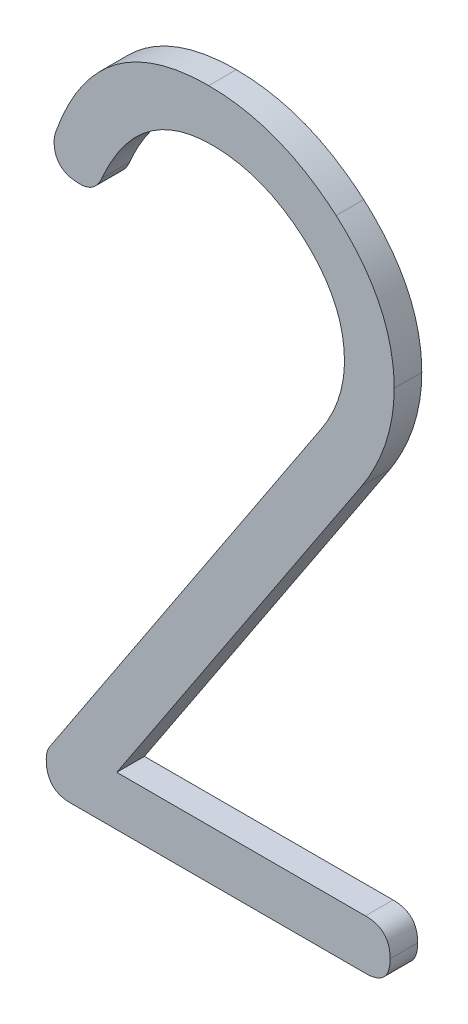
ISO-10303-21;
HEADER;
FILE_DESCRIPTION(('STEP AP214'),'2;1');
FILE_NAME('part.step','',(''),(''),'','','');
FILE_SCHEMA(('AUTOMOTIVE_DESIGN { 1 0 10303 214 1 1 1 1 }'));
ENDSEC;
DATA;
#1=APPLICATION_CONTEXT('core data for automotive mechanical design processes');
#2=APPLICATION_PROTOCOL_DEFINITION('international standard','automotive_design',2000,#1);
#3=PRODUCT_CONTEXT('',#1,'mechanical');
#4=PRODUCT('Part','Part','',(#3));
#5=PRODUCT_RELATED_PRODUCT_CATEGORY('part','',(#4));
#6=PRODUCT_DEFINITION_FORMATION('','',#4);
#7=PRODUCT_DEFINITION_CONTEXT('part definition',#1,'design');
#8=PRODUCT_DEFINITION('design','',#6,#7);
#9=PRODUCT_DEFINITION_SHAPE('','',#8);
#10=(LENGTH_UNIT() NAMED_UNIT(*) SI_UNIT(.MILLI.,.METRE.));
#11=(NAMED_UNIT(*) PLANE_ANGLE_UNIT() SI_UNIT($,.RADIAN.));
#12=(NAMED_UNIT(*) SI_UNIT($,.STERADIAN.) SOLID_ANGLE_UNIT());
#13=UNCERTAINTY_MEASURE_WITH_UNIT(LENGTH_MEASURE(1.E-05),#10,'distance_accuracy_value','');
#14=(GEOMETRIC_REPRESENTATION_CONTEXT(3) GLOBAL_UNCERTAINTY_ASSIGNED_CONTEXT((#13)) GLOBAL_UNIT_ASSIGNED_CONTEXT((#10,
#11,#12)) REPRESENTATION_CONTEXT('',''));
#15=CARTESIAN_POINT('',(0.,0.,0.));
#16=DIRECTION('',(0.,0.,1.));
#17=DIRECTION('',(1.,0.,0.));
#18=AXIS2_PLACEMENT_3D('',#15,#16,#17);
#19=CARTESIAN_POINT('',(0.,0.,1.6));
#20=DIRECTION('',(0.,0.,-1.));
#21=DIRECTION('',(-1.,0.,0.));
#22=AXIS2_PLACEMENT_3D('',#19,#20,#21);
#23=PLANE('',#22);
#24=DIRECTION('',(-1.,0.,0.));
#25=VECTOR('',#24,1.);
#26=CARTESIAN_POINT('',(0.,-21.8933047798276,1.6));
#27=LINE('',#26,#25);
#28=CARTESIAN_POINT('',(11.0245562474728,-21.8933047798276,1.6));
#29=VERTEX_POINT('',#28);
#30=CARTESIAN_POINT('',(11.9250562474728,-21.8933047798276,1.6));
#31=VERTEX_POINT('',#30);
#32=EDGE_CURVE('E153',#29,#31,#27,.F.);
#33=ORIENTED_EDGE('',*,*,#32,.T.);
#34=CARTESIAN_POINT('',(11.9250562474728,-21.8933047798276,1.6));
#35=CARTESIAN_POINT('',(12.0143687474728,-21.8933047798276,1.6));
#36=CARTESIAN_POINT('',(12.0143687474728,-21.9833047798276,1.6));
#37=B_SPLINE_CURVE_WITH_KNOTS('',2,(#34,#35,#36),.UNSPECIFIED.,.F.,.F.,(3,3),(0.,1.),.UNSPECIFIED.);
#38=CARTESIAN_POINT('',(12.0143687474728,-21.9833047798276,1.6));
#39=VERTEX_POINT('',#38);
#40=EDGE_CURVE('E148',#31,#39,#37,.T.);
#41=ORIENTED_EDGE('',*,*,#40,.T.);
#42=CARTESIAN_POINT('',(12.0143687474728,-21.9833047798276,1.6));
#43=CARTESIAN_POINT('',(12.0143687474728,-22.0733047798276,1.6));
#44=CARTESIAN_POINT('',(11.9250562474728,-22.0733047798276,1.6));
#45=B_SPLINE_CURVE_WITH_KNOTS('',2,(#42,#43,#44),.UNSPECIFIED.,.F.,.F.,(3,3),(0.,1.),.UNSPECIFIED.);
#46=CARTESIAN_POINT('',(11.9250562474728,-22.0733047798276,1.6));
#47=VERTEX_POINT('',#46);
#48=EDGE_CURVE('E149',#39,#47,#45,.T.);
#49=ORIENTED_EDGE('',*,*,#48,.T.);
#50=DIRECTION('',(1.,0.,0.));
#51=VECTOR('',#50,1.);
#52=CARTESIAN_POINT('',(11.9250562474728,-22.0733047798276,1.6));
#53=LINE('',#52,#51);
#54=CARTESIAN_POINT('',(10.8566187474728,-22.0733047798276,1.6));
#55=VERTEX_POINT('',#54);
#56=EDGE_CURVE('E156',#55,#47,#53,.T.);
#57=ORIENTED_EDGE('',*,*,#56,.F.);
#58=CARTESIAN_POINT('',(10.8566187474728,-22.0733047798276,1.6));
#59=CARTESIAN_POINT('',(10.7690562474728,-22.0733047798276,1.6));
#60=CARTESIAN_POINT('',(10.7690562474728,-21.9787422798276,1.6));
#61=B_SPLINE_CURVE_WITH_KNOTS('',2,(#58,#59,#60),.UNSPECIFIED.,.F.,.F.,(3,3),(0.,1.),.UNSPECIFIED.);
#62=CARTESIAN_POINT('',(10.7690562474728,-21.9787422798276,1.6));
#63=VERTEX_POINT('',#62);
#64=EDGE_CURVE('E175',#55,#63,#61,.T.);
#65=ORIENTED_EDGE('',*,*,#64,.T.);
#66=CARTESIAN_POINT('',(10.7690562474728,-21.9787422798276,1.6));
#67=CARTESIAN_POINT('',(10.7690562474728,-21.9537422798276,1.6));
#68=CARTESIAN_POINT('',(10.7818687474728,-21.9341172798276,1.6));
#69=B_SPLINE_CURVE_WITH_KNOTS('',2,(#66,#67,#68),.UNSPECIFIED.,.F.,.F.,(3,3),(0.,1.),.UNSPECIFIED.);
#70=CARTESIAN_POINT('',(10.7818687474728,-21.9341172798276,1.6));
#71=VERTEX_POINT('',#70);
#72=EDGE_CURVE('E198',#63,#71,#69,.T.);
#73=ORIENTED_EDGE('',*,*,#72,.T.);
#74=DIRECTION('',(-0.551266870823205,-0.834328974165941,0.));
#75=VECTOR('',#74,1.);
#76=CARTESIAN_POINT('',(10.7818687474728,-21.9341172798276,1.6));
#77=LINE('',#76,#75);
#78=CARTESIAN_POINT('',(11.7628062474728,-20.4494922798276,1.6));
#79=VERTEX_POINT('',#78);
#80=EDGE_CURVE('E173',#79,#71,#77,.T.);
#81=ORIENTED_EDGE('',*,*,#80,.F.);
#82=CARTESIAN_POINT('',(11.7628062474728,-20.4494922798276,1.6));
#83=CARTESIAN_POINT('',(11.8490562474728,-20.3209922798276,1.6));
#84=CARTESIAN_POINT('',(11.8490562474728,-20.1906797798276,1.6));
#85=B_SPLINE_CURVE_WITH_KNOTS('',2,(#82,#83,#84),.UNSPECIFIED.,.F.,.F.,(3,3),(0.,1.),.UNSPECIFIED.);
#86=CARTESIAN_POINT('',(11.8490562474728,-20.1906797798276,1.6));
#87=VERTEX_POINT('',#86);
#88=EDGE_CURVE('E166',#79,#87,#85,.T.);
#89=ORIENTED_EDGE('',*,*,#88,.T.);
#90=CARTESIAN_POINT('',(11.8490562474728,-20.1906797798276,1.6));
#91=CARTESIAN_POINT('',(11.8490562474728,-20.0085547798276,1.6));
#92=CARTESIAN_POINT('',(11.6988687474728,-19.8782422798276,1.6));
#93=B_SPLINE_CURVE_WITH_KNOTS('',2,(#90,#91,#92),.UNSPECIFIED.,.F.,.F.,(3,3),(0.,1.),.UNSPECIFIED.);
#94=CARTESIAN_POINT('',(11.6988687474728,-19.8782422798276,1.6));
#95=VERTEX_POINT('',#94);
#96=EDGE_CURVE('E168',#87,#95,#93,.T.);
#97=ORIENTED_EDGE('',*,*,#96,.T.);
#98=CARTESIAN_POINT('',(11.6988687474728,-19.8782422798276,1.6));
#99=CARTESIAN_POINT('',(11.5540562474728,-19.7533047798276,1.6));
#100=CARTESIAN_POINT('',(11.3698687474728,-19.7533047798276,1.6));
#101=B_SPLINE_CURVE_WITH_KNOTS('',2,(#98,#99,#100),.UNSPECIFIED.,.F.,.F.,(3,3),(0.,1.),.UNSPECIFIED.);
#102=CARTESIAN_POINT('',(11.3698687474728,-19.7533047798276,1.6));
#103=VERTEX_POINT('',#102);
#104=EDGE_CURVE('E207',#95,#103,#101,.T.);
#105=ORIENTED_EDGE('',*,*,#104,.T.);
#106=CARTESIAN_POINT('',(11.3698687474728,-19.7533047798276,1.6));
#107=CARTESIAN_POINT('',(11.1016812474728,-19.7533047798276,1.6));
#108=CARTESIAN_POINT('',(10.9711187474728,-20.0563047798276,1.6));
#109=B_SPLINE_CURVE_WITH_KNOTS('',2,(#106,#107,#108),.UNSPECIFIED.,.F.,.F.,(3,3),(0.,1.),.UNSPECIFIED.);
#110=CARTESIAN_POINT('',(10.9711191788554,-20.0563037787094,1.6));
#111=VERTEX_POINT('',#110);
#112=EDGE_CURVE('E211',#103,#111,#109,.T.);
#113=ORIENTED_EDGE('',*,*,#112,.T.);
#114=CARTESIAN_POINT('',(10.9711187474728,-20.0563047798276,1.6));
#115=CARTESIAN_POINT('',(10.9461187474728,-20.1151172798276,1.6));
#116=CARTESIAN_POINT('',(10.8906812474728,-20.1151172798276,1.6));
#117=B_SPLINE_CURVE_WITH_KNOTS('',2,(#114,#115,#116),.UNSPECIFIED.,.F.,.F.,(3,3),(0.,1.),.UNSPECIFIED.);
#118=CARTESIAN_POINT('',(10.8906812474728,-20.1151172798276,1.6));
#119=VERTEX_POINT('',#118);
#120=EDGE_CURVE('E215',#111,#119,#117,.T.);
#121=ORIENTED_EDGE('',*,*,#120,.T.);
#122=CARTESIAN_POINT('',(10.8906812474728,-20.1151172798276,1.6));
#123=CARTESIAN_POINT('',(10.7976812474728,-20.1151172798276,1.6));
#124=CARTESIAN_POINT('',(10.7976812474728,-20.0280547798276,1.6));
#125=B_SPLINE_CURVE_WITH_KNOTS('',2,(#122,#123,#124),.UNSPECIFIED.,.F.,.F.,(3,3),(0.,1.),.UNSPECIFIED.);
#126=CARTESIAN_POINT('',(10.7976812474728,-20.0280547798276,1.6));
#127=VERTEX_POINT('',#126);
#128=EDGE_CURVE('E219',#119,#127,#125,.T.);
#129=ORIENTED_EDGE('',*,*,#128,.T.);
#130=CARTESIAN_POINT('',(10.7976812474728,-20.0280547798276,1.6));
#131=CARTESIAN_POINT('',(10.7976792285717,-20.0252467453481,1.6));
#132=CARTESIAN_POINT('',(10.797804933066,-20.0224405098755,1.6));
#133=CARTESIAN_POINT('',(10.7983007773129,-20.0168496683755,1.6));
#134=CARTESIAN_POINT('',(10.7986709094223,-20.0140650616746,1.6));
#135=CARTESIAN_POINT('',(10.8000643579977,-20.0061514533547,1.6));
#136=CARTESIAN_POINT('',(10.8013756979969,-20.00107116992,1.6));
#137=CARTESIAN_POINT('',(10.8030562474728,-19.9961172798276,1.6));
#138=B_SPLINE_CURVE_WITH_KNOTS('',3,(#130,#131,#132,#133,#134,#135,#136,#137),.UNSPECIFIED.,.F.,
.F.,(4,2,2,4),(0.,0.00841794083901714,0.0168356184631096,0.0325110517744318),.UNSPECIFIED.);
#139=CARTESIAN_POINT('',(10.8030562474728,-19.9961172798276,1.6));
#140=VERTEX_POINT('',#139);
#141=EDGE_CURVE('E23',#127,#140,#138,.T.);
#142=ORIENTED_EDGE('',*,*,#141,.T.);
#143=CARTESIAN_POINT('',(10.8030562474728,-19.9961172798276,1.6));
#144=CARTESIAN_POINT('',(10.9527437474728,-19.5733047798276,1.6));
#145=CARTESIAN_POINT('',(11.3572437474728,-19.5733047798276,1.6));
#146=B_SPLINE_CURVE_WITH_KNOTS('',2,(#143,#144,#145),.UNSPECIFIED.,.F.,.F.,(3,3),(0.,1.),.UNSPECIFIED.);
#147=CARTESIAN_POINT('',(11.3572437474728,-19.5733047798276,1.6));
#148=VERTEX_POINT('',#147);
#149=EDGE_CURVE('E223',#140,#148,#146,.T.);
#150=ORIENTED_EDGE('',*,*,#149,.T.);
#151=CARTESIAN_POINT('',(11.3572437474728,-19.5733047798276,1.6));
#152=CARTESIAN_POINT('',(11.6156187474728,-19.5733047798276,1.6));
#153=CARTESIAN_POINT('',(11.8188062474728,-19.7498672798276,1.6));
#154=B_SPLINE_CURVE_WITH_KNOTS('',2,(#151,#152,#153),.UNSPECIFIED.,.F.,.F.,(3,3),(0.,1.),.UNSPECIFIED.);
#155=CARTESIAN_POINT('',(11.8188062474728,-19.7498672798276,1.6));
#156=VERTEX_POINT('',#155);
#157=EDGE_CURVE('E227',#148,#156,#154,.T.);
#158=ORIENTED_EDGE('',*,*,#157,.T.);
#159=CARTESIAN_POINT('',(11.8188062474728,-19.7498672798276,1.6));
#160=CARTESIAN_POINT('',(12.0290562474728,-19.9334922798276,1.6));
#161=CARTESIAN_POINT('',(12.0290562474728,-20.1867422798276,1.6));
#162=B_SPLINE_CURVE_WITH_KNOTS('',2,(#159,#160,#161),.UNSPECIFIED.,.F.,.F.,(3,3),(0.,1.),.UNSPECIFIED.);
#163=CARTESIAN_POINT('',(12.0290562474728,-20.1867422798276,1.6));
#164=VERTEX_POINT('',#163);
#165=EDGE_CURVE('E231',#156,#164,#162,.T.);
#166=ORIENTED_EDGE('',*,*,#165,.T.);
#167=CARTESIAN_POINT('',(12.0290562474728,-20.1867422798276,1.6));
#168=CARTESIAN_POINT('',(12.0290562474728,-20.3704297798276,1.6));
#169=CARTESIAN_POINT('',(11.9125562474728,-20.5504922798276,1.6));
#170=B_SPLINE_CURVE_WITH_KNOTS('',2,(#167,#168,#169),.UNSPECIFIED.,.F.,.F.,(3,3),(0.,1.),.UNSPECIFIED.);
#171=CARTESIAN_POINT('',(11.9125562474728,-20.5504922798276,1.6));
#172=VERTEX_POINT('',#171);
#173=EDGE_CURVE('E234',#164,#172,#170,.T.);
#174=ORIENTED_EDGE('',*,*,#173,.T.);
#175=DIRECTION('',(-0.551596483330744,-0.834111095464601,0.));
#176=VECTOR('',#175,1.);
#177=CARTESIAN_POINT('',(11.9125562474728,-20.5504922798276,1.6));
#178=LINE('',#177,#176);
#179=EDGE_CURVE('E244',#172,#29,#178,.T.);
#180=ORIENTED_EDGE('',*,*,#179,.T.);
#181=EDGE_LOOP('',(#33,#41,#49,#57,#65,#73,#81,#89,#97,#105,#113,#121,#129,#142,#150,#158,#166,
#174,#180));
#182=FACE_BOUND('',#181,.T.);
#183=ADVANCED_FACE('F17',(#182),#23,.T.);
#184=CARTESIAN_POINT('',(11.9250562474728,-22.0733047798276,1.7));
#185=DIRECTION('',(0.,-1.,0.));
#186=DIRECTION('',(0.,0.,-1.));
#187=AXIS2_PLACEMENT_3D('',#184,#185,#186);
#188=PLANE('',#187);
#189=DIRECTION('',(-1.,0.,0.));
#190=VECTOR('',#189,1.);
#191=CARTESIAN_POINT('',(0.,-22.0733047798276,1.7));
#192=LINE('',#191,#190);
#193=CARTESIAN_POINT('',(11.9250562474728,-22.0733047798276,1.7));
#194=VERTEX_POINT('',#193);
#195=CARTESIAN_POINT('',(10.8566187474728,-22.0733047798276,1.7));
#196=VERTEX_POINT('',#195);
#197=EDGE_CURVE('E161',#194,#196,#192,.T.);
#198=ORIENTED_EDGE('',*,*,#197,.T.);
#199=DIRECTION('',(0.,0.,-1.));
#200=VECTOR('',#199,1.);
#201=CARTESIAN_POINT('',(10.8566187474728,-22.0733047798276,1.65));
#202=LINE('',#201,#200);
#203=EDGE_CURVE('E392',#196,#55,#202,.T.);
#204=ORIENTED_EDGE('',*,*,#203,.T.);
#205=ORIENTED_EDGE('',*,*,#56,.T.);
#206=DIRECTION('',(0.,0.,1.));
#207=VECTOR('',#206,1.);
#208=CARTESIAN_POINT('',(11.9250562474728,-22.0733047798276,1.65));
#209=LINE('',#208,#207);
#210=EDGE_CURVE('E162',#47,#194,#209,.T.);
#211=ORIENTED_EDGE('',*,*,#210,.T.);
#212=EDGE_LOOP('',(#198,#204,#205,#211));
#213=FACE_BOUND('',#212,.T.);
#214=ADVANCED_FACE('F187',(#213),#188,.T.);
#215=CARTESIAN_POINT('',(10.8566187474728,-22.0733047798276,1.7));
#216=CARTESIAN_POINT('',(10.7690562474728,-22.0733047798276,1.7));
#217=CARTESIAN_POINT('',(10.7690562474728,-21.9787422798276,1.7));
#218=CARTESIAN_POINT('',(10.8566187474728,-22.0733047798276,1.6));
#219=CARTESIAN_POINT('',(10.7690562474728,-22.0733047798276,1.6));
#220=CARTESIAN_POINT('',(10.7690562474728,-21.9787422798276,1.6));
#221=B_SPLINE_SURFACE_WITH_KNOTS('',1,2,((#215,#216,#217),(#218,#219,#220)),.UNSPECIFIED.,.F.,
.F.,.F.,(2,2),(3,3),(0.,1.),(0.,1.),.UNSPECIFIED.);
#222=CARTESIAN_POINT('',(10.8566187474728,-22.0733047798276,1.7));
#223=CARTESIAN_POINT('',(10.7690562474728,-22.0733047798276,1.7));
#224=CARTESIAN_POINT('',(10.7690562474728,-21.9787422798276,1.7));
#225=B_SPLINE_CURVE_WITH_KNOTS('',2,(#222,#223,#224),.UNSPECIFIED.,.F.,.F.,(3,3),(0.,1.),.UNSPECIFIED.);
#226=CARTESIAN_POINT('',(10.7690562474728,-21.9787422798276,1.7));
#227=VERTEX_POINT('',#226);
#228=EDGE_CURVE('E278',#196,#227,#225,.T.);
#229=DIRECTION('',(0.,0.,-1.));
#230=VECTOR('',#229,1.);
#231=CARTESIAN_POINT('',(10.7690562474728,-21.9787422798276,1.65));
#232=LINE('',#231,#230);
#233=EDGE_CURVE('E389',#227,#63,#232,.T.);
#234=ORIENTED_EDGE('',*,*,#203,.F.);
#235=ORIENTED_EDGE('',*,*,#228,.T.);
#236=ORIENTED_EDGE('',*,*,#233,.T.);
#237=ORIENTED_EDGE('',*,*,#64,.F.);
#238=EDGE_LOOP('',(#234,#235,#236,#237));
#239=FACE_BOUND('',#238,.T.);
#240=ADVANCED_FACE('F189',(#239),#221,.F.);
#241=CARTESIAN_POINT('',(10.7690562474728,-21.9787422798276,1.7));
#242=CARTESIAN_POINT('',(10.7690562474728,-21.9537422798276,1.7));
#243=CARTESIAN_POINT('',(10.7818687474728,-21.9341172798276,1.7));
#244=CARTESIAN_POINT('',(10.7690562474728,-21.9787422798276,1.6));
#245=CARTESIAN_POINT('',(10.7690562474728,-21.9537422798276,1.6));
#246=CARTESIAN_POINT('',(10.7818687474728,-21.9341172798276,1.6));
#247=B_SPLINE_SURFACE_WITH_KNOTS('',1,2,((#241,#242,#243),(#244,#245,#246)),.UNSPECIFIED.,.F.,
.F.,.F.,(2,2),(3,3),(0.,1.),(0.,1.),.UNSPECIFIED.);
#248=CARTESIAN_POINT('',(10.7690562474728,-21.9787422798276,1.7));
#249=CARTESIAN_POINT('',(10.7690562474728,-21.9537422798276,1.7));
#250=CARTESIAN_POINT('',(10.7818687474728,-21.9341172798276,1.7));
#251=B_SPLINE_CURVE_WITH_KNOTS('',2,(#248,#249,#250),.UNSPECIFIED.,.F.,.F.,(3,3),(0.,1.),.UNSPECIFIED.);
#252=CARTESIAN_POINT('',(10.7818687474728,-21.9341172798276,1.7));
#253=VERTEX_POINT('',#252);
#254=EDGE_CURVE('E282',#227,#253,#251,.T.);
#255=DIRECTION('',(0.,0.,1.));
#256=VECTOR('',#255,1.);
#257=CARTESIAN_POINT('',(10.7818687474728,-21.9341172798276,1.7));
#258=LINE('',#257,#256);
#259=EDGE_CURVE('E387',#71,#253,#258,.T.);
#260=ORIENTED_EDGE('',*,*,#233,.F.);
#261=ORIENTED_EDGE('',*,*,#254,.T.);
#262=ORIENTED_EDGE('',*,*,#259,.F.);
#263=ORIENTED_EDGE('',*,*,#72,.F.);
#264=EDGE_LOOP('',(#260,#261,#262,#263));
#265=FACE_BOUND('',#264,.T.);
#266=ADVANCED_FACE('F404',(#265),#247,.F.);
#267=CARTESIAN_POINT('',(10.7818687474728,-21.9341172798276,1.7));
#268=DIRECTION('',(-0.834328974165941,0.551266870823205,0.));
#269=DIRECTION('',(-0.551266870823205,-0.834328974165941,0.));
#270=AXIS2_PLACEMENT_3D('',#267,#268,#269);
#271=PLANE('',#270);
#272=DIRECTION('',(0.551266870823206,0.834328974165941,0.));
#273=VECTOR('',#272,1.);
#274=CARTESIAN_POINT('',(10.7818687474728,-21.9341172798276,1.7));
#275=LINE('',#274,#273);
#276=CARTESIAN_POINT('',(11.7628062474728,-20.4494922798276,1.7));
#277=VERTEX_POINT('',#276);
#278=EDGE_CURVE('E340',#253,#277,#275,.T.);
#279=ORIENTED_EDGE('',*,*,#278,.T.);
#280=DIRECTION('',(0.,0.,-1.));
#281=VECTOR('',#280,1.);
#282=CARTESIAN_POINT('',(11.7628062474728,-20.4494922798276,1.65));
#283=LINE('',#282,#281);
#284=EDGE_CURVE('E384',#277,#79,#283,.T.);
#285=ORIENTED_EDGE('',*,*,#284,.T.);
#286=ORIENTED_EDGE('',*,*,#80,.T.);
#287=ORIENTED_EDGE('',*,*,#259,.T.);
#288=EDGE_LOOP('',(#279,#285,#286,#287));
#289=FACE_BOUND('',#288,.T.);
#290=ADVANCED_FACE('F412',(#289),#271,.T.);
#291=CARTESIAN_POINT('',(11.7628062474728,-20.4494922798276,1.7));
#292=CARTESIAN_POINT('',(11.8490562474728,-20.3209922798276,1.7));
#293=CARTESIAN_POINT('',(11.8490562474728,-20.1906797798276,1.7));
#294=CARTESIAN_POINT('',(11.7628062474728,-20.4494922798276,1.6));
#295=CARTESIAN_POINT('',(11.8490562474728,-20.3209922798276,1.6));
#296=CARTESIAN_POINT('',(11.8490562474728,-20.1906797798276,1.6));
#297=B_SPLINE_SURFACE_WITH_KNOTS('',1,2,((#291,#292,#293),(#294,#295,#296)),.UNSPECIFIED.,.F.,
.F.,.F.,(2,2),(3,3),(0.,1.),(0.,1.),.UNSPECIFIED.);
#298=CARTESIAN_POINT('',(11.7628062474728,-20.4494922798276,1.7));
#299=CARTESIAN_POINT('',(11.8490562474728,-20.3209922798276,1.7));
#300=CARTESIAN_POINT('',(11.8490562474728,-20.1906797798276,1.7));
#301=B_SPLINE_CURVE_WITH_KNOTS('',2,(#298,#299,#300),.UNSPECIFIED.,.F.,.F.,(3,3),(0.,1.),.UNSPECIFIED.);
#302=CARTESIAN_POINT('',(11.8490562474728,-20.1906797798276,1.7));
#303=VERTEX_POINT('',#302);
#304=EDGE_CURVE('E286',#277,#303,#301,.T.);
#305=DIRECTION('',(0.,0.,-1.));
#306=VECTOR('',#305,1.);
#307=CARTESIAN_POINT('',(11.8490562474728,-20.1906797798276,1.65));
#308=LINE('',#307,#306);
#309=EDGE_CURVE('E381',#303,#87,#308,.T.);
#310=ORIENTED_EDGE('',*,*,#284,.F.);
#311=ORIENTED_EDGE('',*,*,#304,.T.);
#312=ORIENTED_EDGE('',*,*,#309,.T.);
#313=ORIENTED_EDGE('',*,*,#88,.F.);
#314=EDGE_LOOP('',(#310,#311,#312,#313));
#315=FACE_BOUND('',#314,.T.);
#316=ADVANCED_FACE('F416',(#315),#297,.F.);
#317=CARTESIAN_POINT('',(11.8490562474728,-20.1906797798276,1.7));
#318=CARTESIAN_POINT('',(11.8490562474728,-20.0085547798276,1.7));
#319=CARTESIAN_POINT('',(11.6988687474728,-19.8782422798276,1.7));
#320=CARTESIAN_POINT('',(11.8490562474728,-20.1906797798276,1.6));
#321=CARTESIAN_POINT('',(11.8490562474728,-20.0085547798276,1.6));
#322=CARTESIAN_POINT('',(11.6988687474728,-19.8782422798276,1.6));
#323=B_SPLINE_SURFACE_WITH_KNOTS('',1,2,((#317,#318,#319),(#320,#321,#322)),.UNSPECIFIED.,.F.,
.F.,.F.,(2,2),(3,3),(0.,1.),(0.,1.),.UNSPECIFIED.);
#324=CARTESIAN_POINT('',(11.8490562474728,-20.1906797798276,1.7));
#325=CARTESIAN_POINT('',(11.8490562474728,-20.0085547798276,1.7));
#326=CARTESIAN_POINT('',(11.6988687474728,-19.8782422798276,1.7));
#327=B_SPLINE_CURVE_WITH_KNOTS('',2,(#324,#325,#326),.UNSPECIFIED.,.F.,.F.,(3,3),(0.,1.),.UNSPECIFIED.);
#328=CARTESIAN_POINT('',(11.6988687474728,-19.8782422798276,1.7));
#329=VERTEX_POINT('',#328);
#330=EDGE_CURVE('E290',#303,#329,#327,.T.);
#331=DIRECTION('',(0.,0.,-1.));
#332=VECTOR('',#331,1.);
#333=CARTESIAN_POINT('',(11.6988687474728,-19.8782422798276,1.65));
#334=LINE('',#333,#332);
#335=EDGE_CURVE('E378',#329,#95,#334,.T.);
#336=ORIENTED_EDGE('',*,*,#309,.F.);
#337=ORIENTED_EDGE('',*,*,#330,.T.);
#338=ORIENTED_EDGE('',*,*,#335,.T.);
#339=ORIENTED_EDGE('',*,*,#96,.F.);
#340=EDGE_LOOP('',(#336,#337,#338,#339));
#341=FACE_BOUND('',#340,.T.);
#342=ADVANCED_FACE('F419',(#341),#323,.F.);
#343=CARTESIAN_POINT('',(11.6988687474728,-19.8782422798276,1.7));
#344=CARTESIAN_POINT('',(11.5540562474728,-19.7533047798276,1.7));
#345=CARTESIAN_POINT('',(11.3698687474728,-19.7533047798276,1.7));
#346=CARTESIAN_POINT('',(11.6988687474728,-19.8782422798276,1.6));
#347=CARTESIAN_POINT('',(11.5540562474728,-19.7533047798276,1.6));
#348=CARTESIAN_POINT('',(11.3698687474728,-19.7533047798276,1.6));
#349=B_SPLINE_SURFACE_WITH_KNOTS('',1,2,((#343,#344,#345),(#346,#347,#348)),.UNSPECIFIED.,.F.,
.F.,.F.,(2,2),(3,3),(0.,1.),(0.,1.),.UNSPECIFIED.);
#350=CARTESIAN_POINT('',(11.6988687474728,-19.8782422798276,1.7));
#351=CARTESIAN_POINT('',(11.5540562474728,-19.7533047798276,1.7));
#352=CARTESIAN_POINT('',(11.3698687474728,-19.7533047798276,1.7));
#353=B_SPLINE_CURVE_WITH_KNOTS('',2,(#350,#351,#352),.UNSPECIFIED.,.F.,.F.,(3,3),(0.,1.),.UNSPECIFIED.);
#354=CARTESIAN_POINT('',(11.3698687474728,-19.7533047798276,1.7));
#355=VERTEX_POINT('',#354);
#356=EDGE_CURVE('E294',#329,#355,#353,.T.);
#357=DIRECTION('',(0.,0.,-1.));
#358=VECTOR('',#357,1.);
#359=CARTESIAN_POINT('',(11.3698687474728,-19.7533047798276,1.65));
#360=LINE('',#359,#358);
#361=EDGE_CURVE('E375',#355,#103,#360,.T.);
#362=ORIENTED_EDGE('',*,*,#335,.F.);
#363=ORIENTED_EDGE('',*,*,#356,.T.);
#364=ORIENTED_EDGE('',*,*,#361,.T.);
#365=ORIENTED_EDGE('',*,*,#104,.F.);
#366=EDGE_LOOP('',(#362,#363,#364,#365));
#367=FACE_BOUND('',#366,.T.);
#368=ADVANCED_FACE('F467',(#367),#349,.F.);
#369=CARTESIAN_POINT('',(11.3698687474728,-19.7533047798276,1.7));
#370=CARTESIAN_POINT('',(11.1016812474728,-19.7533047798276,1.7));
#371=CARTESIAN_POINT('',(10.9711187474728,-20.0563047798276,1.7));
#372=CARTESIAN_POINT('',(11.3698687474728,-19.7533047798276,1.6));
#373=CARTESIAN_POINT('',(11.1016812474728,-19.7533047798276,1.6));
#374=CARTESIAN_POINT('',(10.9711187474728,-20.0563047798276,1.6));
#375=B_SPLINE_SURFACE_WITH_KNOTS('',1,2,((#369,#370,#371),(#372,#373,#374)),.UNSPECIFIED.,.F.,
.F.,.F.,(2,2),(3,3),(0.,1.),(0.,1.),.UNSPECIFIED.);
#376=CARTESIAN_POINT('',(11.3698687474728,-19.7533047798276,1.7));
#377=CARTESIAN_POINT('',(11.1016812474728,-19.7533047798276,1.7));
#378=CARTESIAN_POINT('',(10.9711187474728,-20.0563047798276,1.7));
#379=B_SPLINE_CURVE_WITH_KNOTS('',2,(#376,#377,#378),.UNSPECIFIED.,.F.,.F.,(3,3),(0.,1.),.UNSPECIFIED.);
#380=CARTESIAN_POINT('',(10.9711187474728,-20.0563047798276,1.7));
#381=VERTEX_POINT('',#380);
#382=EDGE_CURVE('E298',#355,#381,#379,.T.);
#383=DIRECTION('',(0.,0.,-1.));
#384=VECTOR('',#383,1.);
#385=CARTESIAN_POINT('',(10.9711187474728,-20.0563047798276,1.65));
#386=LINE('',#385,#384);
#387=EDGE_CURVE('E372',#381,#111,#386,.T.);
#388=ORIENTED_EDGE('',*,*,#361,.F.);
#389=ORIENTED_EDGE('',*,*,#382,.T.);
#390=ORIENTED_EDGE('',*,*,#387,.T.);
#391=ORIENTED_EDGE('',*,*,#112,.F.);
#392=EDGE_LOOP('',(#388,#389,#390,#391));
#393=FACE_BOUND('',#392,.T.);
#394=ADVANCED_FACE('F468',(#393),#375,.F.);
#395=CARTESIAN_POINT('',(10.9711187474728,-20.0563047798276,1.7));
#396=CARTESIAN_POINT('',(10.9461187474728,-20.1151172798276,1.7));
#397=CARTESIAN_POINT('',(10.8906812474728,-20.1151172798276,1.7));
#398=CARTESIAN_POINT('',(10.9711187474728,-20.0563047798276,1.6));
#399=CARTESIAN_POINT('',(10.9461187474728,-20.1151172798276,1.6));
#400=CARTESIAN_POINT('',(10.8906812474728,-20.1151172798276,1.6));
#401=B_SPLINE_SURFACE_WITH_KNOTS('',1,2,((#395,#396,#397),(#398,#399,#400)),.UNSPECIFIED.,.F.,
.F.,.F.,(2,2),(3,3),(0.,1.),(0.,1.),.UNSPECIFIED.);
#402=CARTESIAN_POINT('',(10.9711187474728,-20.0563047798276,1.7));
#403=CARTESIAN_POINT('',(10.9461187474728,-20.1151172798276,1.7));
#404=CARTESIAN_POINT('',(10.8906812474728,-20.1151172798276,1.7));
#405=B_SPLINE_CURVE_WITH_KNOTS('',2,(#402,#403,#404),.UNSPECIFIED.,.F.,.F.,(3,3),(0.,1.),.UNSPECIFIED.);
#406=CARTESIAN_POINT('',(10.8906812474728,-20.1151172798276,1.7));
#407=VERTEX_POINT('',#406);
#408=EDGE_CURVE('E302',#381,#407,#405,.T.);
#409=DIRECTION('',(0.,0.,-1.));
#410=VECTOR('',#409,1.);
#411=CARTESIAN_POINT('',(10.8906812474728,-20.1151172798276,1.65));
#412=LINE('',#411,#410);
#413=EDGE_CURVE('E369',#407,#119,#412,.T.);
#414=ORIENTED_EDGE('',*,*,#387,.F.);
#415=ORIENTED_EDGE('',*,*,#408,.T.);
#416=ORIENTED_EDGE('',*,*,#413,.T.);
#417=ORIENTED_EDGE('',*,*,#120,.F.);
#418=EDGE_LOOP('',(#414,#415,#416,#417));
#419=FACE_BOUND('',#418,.T.);
#420=ADVANCED_FACE('F469',(#419),#401,.F.);
#421=CARTESIAN_POINT('',(10.8906812474728,-20.1151172798276,1.7));
#422=CARTESIAN_POINT('',(10.7976812474728,-20.1151172798276,1.7));
#423=CARTESIAN_POINT('',(10.7976812474728,-20.0280547798276,1.7));
#424=CARTESIAN_POINT('',(10.8906812474728,-20.1151172798276,1.6));
#425=CARTESIAN_POINT('',(10.7976812474728,-20.1151172798276,1.6));
#426=CARTESIAN_POINT('',(10.7976812474728,-20.0280547798276,1.6));
#427=B_SPLINE_SURFACE_WITH_KNOTS('',1,2,((#421,#422,#423),(#424,#425,#426)),.UNSPECIFIED.,.F.,
.F.,.F.,(2,2),(3,3),(0.,1.),(0.,1.),.UNSPECIFIED.);
#428=CARTESIAN_POINT('',(10.8906812474728,-20.1151172798276,1.7));
#429=CARTESIAN_POINT('',(10.7976812474728,-20.1151172798276,1.7));
#430=CARTESIAN_POINT('',(10.7976812474728,-20.0280547798276,1.7));
#431=B_SPLINE_CURVE_WITH_KNOTS('',2,(#428,#429,#430),.UNSPECIFIED.,.F.,.F.,(3,3),(0.,1.),.UNSPECIFIED.);
#432=CARTESIAN_POINT('',(10.7976812474728,-20.0280547798276,1.7));
#433=VERTEX_POINT('',#432);
#434=EDGE_CURVE('E256',#407,#433,#431,.T.);
#435=DIRECTION('',(0.,0.,-1.));
#436=VECTOR('',#435,1.);
#437=CARTESIAN_POINT('',(10.7976812474728,-20.0280547798276,1.65));
#438=LINE('',#437,#436);
#439=EDGE_CURVE('E366',#433,#127,#438,.T.);
#440=ORIENTED_EDGE('',*,*,#413,.F.);
#441=ORIENTED_EDGE('',*,*,#434,.T.);
#442=ORIENTED_EDGE('',*,*,#439,.T.);
#443=ORIENTED_EDGE('',*,*,#128,.F.);
#444=EDGE_LOOP('',(#440,#441,#442,#443));
#445=FACE_BOUND('',#444,.T.);
#446=ADVANCED_FACE('F457',(#445),#427,.F.);
#447=CARTESIAN_POINT('',(10.7976812474728,-20.0280547798276,1.7));
#448=CARTESIAN_POINT('',(10.7976812474728,-20.0120547798276,1.7));
#449=CARTESIAN_POINT('',(10.8030562474728,-19.9961172798276,1.7));
#450=CARTESIAN_POINT('',(10.7976812474728,-20.0280547798276,1.6));
#451=CARTESIAN_POINT('',(10.7976812474728,-20.0120547798276,1.6));
#452=CARTESIAN_POINT('',(10.8030562474728,-19.9961172798276,1.6));
#453=B_SPLINE_SURFACE_WITH_KNOTS('',1,2,((#447,#448,#449),(#450,#451,#452)),.UNSPECIFIED.,.F.,
.F.,.F.,(2,2),(3,3),(0.,1.),(0.,1.),.UNSPECIFIED.);
#454=CARTESIAN_POINT('',(10.7976812474728,-20.0280547798276,1.7));
#455=CARTESIAN_POINT('',(10.7976792285717,-20.0252467453481,1.7));
#456=CARTESIAN_POINT('',(10.797804933066,-20.0224405098755,1.7));
#457=CARTESIAN_POINT('',(10.7983007773129,-20.0168496683755,1.7));
#458=CARTESIAN_POINT('',(10.7986709094223,-20.0140650616746,1.7));
#459=CARTESIAN_POINT('',(10.8000643579977,-20.0061514533547,1.7));
#460=CARTESIAN_POINT('',(10.8013756979969,-20.00107116992,1.7));
#461=CARTESIAN_POINT('',(10.8030562474728,-19.9961172798276,1.7));
#462=B_SPLINE_CURVE_WITH_KNOTS('',3,(#454,#455,#456,#457,#458,#459,#460,#461),.UNSPECIFIED.,.F.,
.F.,(4,2,2,4),(0.,0.00841794083901714,0.0168356184631096,0.0325110517744318),.UNSPECIFIED.);
#463=CARTESIAN_POINT('',(10.8030562474728,-19.9961172798276,1.7));
#464=VERTEX_POINT('',#463);
#465=EDGE_CURVE('E249',#433,#464,#462,.T.);
#466=DIRECTION('',(0.,0.,-1.));
#467=VECTOR('',#466,1.);
#468=CARTESIAN_POINT('',(10.8030562474728,-19.9961172798276,1.65));
#469=LINE('',#468,#467);
#470=EDGE_CURVE('E363',#464,#140,#469,.T.);
#471=ORIENTED_EDGE('',*,*,#439,.F.);
#472=ORIENTED_EDGE('',*,*,#465,.T.);
#473=ORIENTED_EDGE('',*,*,#470,.T.);
#474=ORIENTED_EDGE('',*,*,#141,.F.);
#475=EDGE_LOOP('',(#471,#472,#473,#474));
#476=FACE_BOUND('',#475,.T.);
#477=ADVANCED_FACE('F257',(#476),#453,.F.);
#478=CARTESIAN_POINT('',(10.8030562474728,-19.9961172798276,1.7));
#479=CARTESIAN_POINT('',(10.9527437474728,-19.5733047798276,1.7));
#480=CARTESIAN_POINT('',(11.3572437474728,-19.5733047798276,1.7));
#481=CARTESIAN_POINT('',(10.8030562474728,-19.9961172798276,1.6));
#482=CARTESIAN_POINT('',(10.9527437474728,-19.5733047798276,1.6));
#483=CARTESIAN_POINT('',(11.3572437474728,-19.5733047798276,1.6));
#484=B_SPLINE_SURFACE_WITH_KNOTS('',1,2,((#478,#479,#480),(#481,#482,#483)),.UNSPECIFIED.,.F.,
.F.,.F.,(2,2),(3,3),(0.,1.),(0.,1.),.UNSPECIFIED.);
#485=CARTESIAN_POINT('',(10.8030562474728,-19.9961172798276,1.7));
#486=CARTESIAN_POINT('',(10.9527437474728,-19.5733047798276,1.7));
#487=CARTESIAN_POINT('',(11.3572437474728,-19.5733047798276,1.7));
#488=B_SPLINE_CURVE_WITH_KNOTS('',2,(#485,#486,#487),.UNSPECIFIED.,.F.,.F.,(3,3),(0.,1.),.UNSPECIFIED.);
#489=CARTESIAN_POINT('',(11.3572437474728,-19.5733047798276,1.7));
#490=VERTEX_POINT('',#489);
#491=EDGE_CURVE('E255',#464,#490,#488,.T.);
#492=DIRECTION('',(0.,0.,-1.));
#493=VECTOR('',#492,1.);
#494=CARTESIAN_POINT('',(11.3572437474728,-19.5733047798276,1.65));
#495=LINE('',#494,#493);
#496=EDGE_CURVE('E360',#490,#148,#495,.T.);
#497=ORIENTED_EDGE('',*,*,#470,.F.);
#498=ORIENTED_EDGE('',*,*,#491,.T.);
#499=ORIENTED_EDGE('',*,*,#496,.T.);
#500=ORIENTED_EDGE('',*,*,#149,.F.);
#501=EDGE_LOOP('',(#497,#498,#499,#500));
#502=FACE_BOUND('',#501,.T.);
#503=ADVANCED_FACE('F451',(#502),#484,.F.);
#504=CARTESIAN_POINT('',(11.3572437474728,-19.5733047798276,1.7));
#505=CARTESIAN_POINT('',(11.6156187474728,-19.5733047798276,1.7));
#506=CARTESIAN_POINT('',(11.8188062474728,-19.7498672798276,1.7));
#507=CARTESIAN_POINT('',(11.3572437474728,-19.5733047798276,1.6));
#508=CARTESIAN_POINT('',(11.6156187474728,-19.5733047798276,1.6));
#509=CARTESIAN_POINT('',(11.8188062474728,-19.7498672798276,1.6));
#510=B_SPLINE_SURFACE_WITH_KNOTS('',1,2,((#504,#505,#506),(#507,#508,#509)),.UNSPECIFIED.,.F.,
.F.,.F.,(2,2),(3,3),(0.,1.),(0.,1.),.UNSPECIFIED.);
#511=CARTESIAN_POINT('',(11.3572437474728,-19.5733047798276,1.7));
#512=CARTESIAN_POINT('',(11.6156187474728,-19.5733047798276,1.7));
#513=CARTESIAN_POINT('',(11.8188062474728,-19.7498672798276,1.7));
#514=B_SPLINE_CURVE_WITH_KNOTS('',2,(#511,#512,#513),.UNSPECIFIED.,.F.,.F.,(3,3),(0.,1.),.UNSPECIFIED.);
#515=CARTESIAN_POINT('',(11.8188062474728,-19.7498672798276,1.7));
#516=VERTEX_POINT('',#515);
#517=EDGE_CURVE('E312',#490,#516,#514,.T.);
#518=DIRECTION('',(0.,0.,-1.));
#519=VECTOR('',#518,1.);
#520=CARTESIAN_POINT('',(11.8188062474728,-19.7498672798276,1.65));
#521=LINE('',#520,#519);
#522=EDGE_CURVE('E357',#516,#156,#521,.T.);
#523=ORIENTED_EDGE('',*,*,#496,.F.);
#524=ORIENTED_EDGE('',*,*,#517,.T.);
#525=ORIENTED_EDGE('',*,*,#522,.T.);
#526=ORIENTED_EDGE('',*,*,#157,.F.);
#527=EDGE_LOOP('',(#523,#524,#525,#526));
#528=FACE_BOUND('',#527,.T.);
#529=ADVANCED_FACE('F614',(#528),#510,.F.);
#530=CARTESIAN_POINT('',(11.8188062474728,-19.7498672798276,1.7));
#531=CARTESIAN_POINT('',(12.0290562474728,-19.9334922798276,1.7));
#532=CARTESIAN_POINT('',(12.0290562474728,-20.1867422798276,1.7));
#533=CARTESIAN_POINT('',(11.8188062474728,-19.7498672798276,1.6));
#534=CARTESIAN_POINT('',(12.0290562474728,-19.9334922798276,1.6));
#535=CARTESIAN_POINT('',(12.0290562474728,-20.1867422798276,1.6));
#536=B_SPLINE_SURFACE_WITH_KNOTS('',1,2,((#530,#531,#532),(#533,#534,#535)),.UNSPECIFIED.,.F.,
.F.,.F.,(2,2),(3,3),(0.,1.),(0.,1.),.UNSPECIFIED.);
#537=CARTESIAN_POINT('',(11.8188062474728,-19.7498672798276,1.7));
#538=CARTESIAN_POINT('',(12.0290562474728,-19.9334922798276,1.7));
#539=CARTESIAN_POINT('',(12.0290562474728,-20.1867422798276,1.7));
#540=B_SPLINE_CURVE_WITH_KNOTS('',2,(#537,#538,#539),.UNSPECIFIED.,.F.,.F.,(3,3),(0.,1.),.UNSPECIFIED.);
#541=CARTESIAN_POINT('',(12.0290562474728,-20.1867422798276,1.7));
#542=VERTEX_POINT('',#541);
#543=EDGE_CURVE('E316',#516,#542,#540,.T.);
#544=DIRECTION('',(0.,0.,-1.));
#545=VECTOR('',#544,1.);
#546=CARTESIAN_POINT('',(12.0290562474728,-20.1867422798276,1.65));
#547=LINE('',#546,#545);
#548=EDGE_CURVE('E354',#542,#164,#547,.T.);
#549=ORIENTED_EDGE('',*,*,#522,.F.);
#550=ORIENTED_EDGE('',*,*,#543,.T.);
#551=ORIENTED_EDGE('',*,*,#548,.T.);
#552=ORIENTED_EDGE('',*,*,#165,.F.);
#553=EDGE_LOOP('',(#549,#550,#551,#552));
#554=FACE_BOUND('',#553,.T.);
#555=ADVANCED_FACE('F446',(#554),#536,.F.);
#556=CARTESIAN_POINT('',(12.0290562474728,-20.1867422798276,1.7));
#557=CARTESIAN_POINT('',(12.0290562474728,-20.3704297798276,1.7));
#558=CARTESIAN_POINT('',(11.9125562474728,-20.5504922798276,1.7));
#559=CARTESIAN_POINT('',(12.0290562474728,-20.1867422798276,1.6));
#560=CARTESIAN_POINT('',(12.0290562474728,-20.3704297798276,1.6));
#561=CARTESIAN_POINT('',(11.9125562474728,-20.5504922798276,1.6));
#562=B_SPLINE_SURFACE_WITH_KNOTS('',1,2,((#556,#557,#558),(#559,#560,#561)),.UNSPECIFIED.,.F.,
.F.,.F.,(2,2),(3,3),(0.,1.),(0.,1.),.UNSPECIFIED.);
#563=CARTESIAN_POINT('',(12.0290562474728,-20.1867422798276,1.7));
#564=CARTESIAN_POINT('',(12.0290562474728,-20.3704297798276,1.7));
#565=CARTESIAN_POINT('',(11.9125562474728,-20.5504922798276,1.7));
#566=B_SPLINE_CURVE_WITH_KNOTS('',2,(#563,#564,#565),.UNSPECIFIED.,.F.,.F.,(3,3),(0.,1.),.UNSPECIFIED.);
#567=CARTESIAN_POINT('',(11.9125562474728,-20.5504922798276,1.7));
#568=VERTEX_POINT('',#567);
#569=EDGE_CURVE('E319',#542,#568,#566,.T.);
#570=DIRECTION('',(0.,0.,1.));
#571=VECTOR('',#570,1.);
#572=CARTESIAN_POINT('',(11.9125562474728,-20.5504922798276,1.7));
#573=LINE('',#572,#571);
#574=EDGE_CURVE('E350',#172,#568,#573,.T.);
#575=ORIENTED_EDGE('',*,*,#548,.F.);
#576=ORIENTED_EDGE('',*,*,#569,.T.);
#577=ORIENTED_EDGE('',*,*,#574,.F.);
#578=ORIENTED_EDGE('',*,*,#173,.F.);
#579=EDGE_LOOP('',(#575,#576,#577,#578));
#580=FACE_BOUND('',#579,.T.);
#581=ADVANCED_FACE('F434',(#580),#562,.F.);
#582=CARTESIAN_POINT('',(11.9125562474728,-20.5504922798276,1.7));
#583=DIRECTION('',(0.8341110954646,-0.551596483330745,0.));
#584=DIRECTION('',(0.551596483330745,0.8341110954646,0.));
#585=AXIS2_PLACEMENT_3D('',#582,#583,#584);
#586=PLANE('',#585);
#587=DIRECTION('',(-0.551596483330744,-0.834111095464601,0.));
#588=VECTOR('',#587,1.);
#589=CARTESIAN_POINT('',(11.9125562474728,-20.5504922798276,1.7));
#590=LINE('',#589,#588);
#591=CARTESIAN_POINT('',(11.0245562474728,-21.8933047798276,1.7));
#592=VERTEX_POINT('',#591);
#593=EDGE_CURVE('E329',#568,#592,#590,.T.);
#594=ORIENTED_EDGE('',*,*,#593,.T.);
#595=DIRECTION('',(0.,0.,1.));
#596=VECTOR('',#595,1.);
#597=CARTESIAN_POINT('',(11.0245562474728,-21.8933047798276,1.7));
#598=LINE('',#597,#596);
#599=EDGE_CURVE('E348',#29,#592,#598,.T.);
#600=ORIENTED_EDGE('',*,*,#599,.F.);
#601=ORIENTED_EDGE('',*,*,#179,.F.);
#602=ORIENTED_EDGE('',*,*,#574,.T.);
#603=EDGE_LOOP('',(#594,#600,#601,#602));
#604=FACE_BOUND('',#603,.T.);
#605=ADVANCED_FACE('F438',(#604),#586,.T.);
#606=CARTESIAN_POINT('',(11.0245562474728,-21.8933047798276,1.7));
#607=DIRECTION('',(0.,1.,0.));
#608=DIRECTION('',(0.,0.,1.));
#609=AXIS2_PLACEMENT_3D('',#606,#607,#608);
#610=PLANE('',#609);
#611=DIRECTION('',(-1.,0.,0.));
#612=VECTOR('',#611,1.);
#613=CARTESIAN_POINT('',(0.,-21.8933047798276,1.7));
#614=LINE('',#613,#612);
#615=CARTESIAN_POINT('',(11.9250562474728,-21.8933047798276,1.7));
#616=VERTEX_POINT('',#615);
#617=EDGE_CURVE('E322',#592,#616,#614,.F.);
#618=ORIENTED_EDGE('',*,*,#617,.T.);
#619=DIRECTION('',(0.,0.,-1.));
#620=VECTOR('',#619,1.);
#621=CARTESIAN_POINT('',(11.9250562474728,-21.8933047798276,1.65));
#622=LINE('',#621,#620);
#623=EDGE_CURVE('E345',#616,#31,#622,.T.);
#624=ORIENTED_EDGE('',*,*,#623,.T.);
#625=ORIENTED_EDGE('',*,*,#32,.F.);
#626=ORIENTED_EDGE('',*,*,#599,.T.);
#627=EDGE_LOOP('',(#618,#624,#625,#626));
#628=FACE_BOUND('',#627,.T.);
#629=ADVANCED_FACE('F268',(#628),#610,.T.);
#630=CARTESIAN_POINT('',(11.9250562474728,-21.8933047798276,1.7));
#631=CARTESIAN_POINT('',(12.0143687474728,-21.8933047798276,1.7));
#632=CARTESIAN_POINT('',(12.0143687474728,-21.9833047798276,1.7));
#633=CARTESIAN_POINT('',(11.9250562474728,-21.8933047798276,1.6));
#634=CARTESIAN_POINT('',(12.0143687474728,-21.8933047798276,1.6));
#635=CARTESIAN_POINT('',(12.0143687474728,-21.9833047798276,1.6));
#636=B_SPLINE_SURFACE_WITH_KNOTS('',1,2,((#630,#631,#632),(#633,#634,#635)),.UNSPECIFIED.,.F.,
.F.,.F.,(2,2),(3,3),(0.,1.),(0.,1.),.UNSPECIFIED.);
#637=CARTESIAN_POINT('',(11.9250562474728,-21.8933047798276,1.7));
#638=CARTESIAN_POINT('',(12.0143687474728,-21.8933047798276,1.7));
#639=CARTESIAN_POINT('',(12.0143687474728,-21.9833047798276,1.7));
#640=B_SPLINE_CURVE_WITH_KNOTS('',2,(#637,#638,#639),.UNSPECIFIED.,.F.,.F.,(3,3),(0.,1.),.UNSPECIFIED.);
#641=CARTESIAN_POINT('',(12.0143687474728,-21.9833047798276,1.7));
#642=VERTEX_POINT('',#641);
#643=EDGE_CURVE('E34',#616,#642,#640,.T.);
#644=DIRECTION('',(0.,0.,-1.));
#645=VECTOR('',#644,1.);
#646=CARTESIAN_POINT('',(12.0143687474728,-21.9833047798276,1.65));
#647=LINE('',#646,#645);
#648=EDGE_CURVE('E42',#642,#39,#647,.T.);
#649=ORIENTED_EDGE('',*,*,#623,.F.);
#650=ORIENTED_EDGE('',*,*,#643,.T.);
#651=ORIENTED_EDGE('',*,*,#648,.T.);
#652=ORIENTED_EDGE('',*,*,#40,.F.);
#653=EDGE_LOOP('',(#649,#650,#651,#652));
#654=FACE_BOUND('',#653,.T.);
#655=ADVANCED_FACE('F159',(#654),#636,.F.);
#656=CARTESIAN_POINT('',(12.0143687474728,-21.9833047798276,1.7));
#657=CARTESIAN_POINT('',(12.0143687474728,-22.0733047798276,1.7));
#658=CARTESIAN_POINT('',(11.9250562474728,-22.0733047798276,1.7));
#659=CARTESIAN_POINT('',(12.0143687474728,-21.9833047798276,1.6));
#660=CARTESIAN_POINT('',(12.0143687474728,-22.0733047798276,1.6));
#661=CARTESIAN_POINT('',(11.9250562474728,-22.0733047798276,1.6));
#662=B_SPLINE_SURFACE_WITH_KNOTS('',1,2,((#656,#657,#658),(#659,#660,#661)),.UNSPECIFIED.,.F.,
.F.,.F.,(2,2),(3,3),(0.,1.),(0.,1.),.UNSPECIFIED.);
#663=CARTESIAN_POINT('',(12.0143687474728,-21.9833047798276,1.7));
#664=CARTESIAN_POINT('',(12.0143687474728,-22.0733047798276,1.7));
#665=CARTESIAN_POINT('',(11.9250562474728,-22.0733047798276,1.7));
#666=B_SPLINE_CURVE_WITH_KNOTS('',2,(#663,#664,#665),.UNSPECIFIED.,.F.,.F.,(3,3),(0.,1.),.UNSPECIFIED.);
#667=EDGE_CURVE('E11',#642,#194,#666,.T.);
#668=ORIENTED_EDGE('',*,*,#648,.F.);
#669=ORIENTED_EDGE('',*,*,#667,.T.);
#670=ORIENTED_EDGE('',*,*,#210,.F.);
#671=ORIENTED_EDGE('',*,*,#48,.F.);
#672=EDGE_LOOP('',(#668,#669,#670,#671));
#673=FACE_BOUND('',#672,.T.);
#674=ADVANCED_FACE('F19',(#673),#662,.F.);
#675=CARTESIAN_POINT('',(0.,0.,1.7));
#676=DIRECTION('',(0.,0.,-1.));
#677=DIRECTION('',(-1.,0.,0.));
#678=AXIS2_PLACEMENT_3D('',#675,#676,#677);
#679=PLANE('',#678);
#680=ORIENTED_EDGE('',*,*,#643,.F.);
#681=ORIENTED_EDGE('',*,*,#617,.F.);
#682=ORIENTED_EDGE('',*,*,#593,.F.);
#683=ORIENTED_EDGE('',*,*,#569,.F.);
#684=ORIENTED_EDGE('',*,*,#543,.F.);
#685=ORIENTED_EDGE('',*,*,#517,.F.);
#686=ORIENTED_EDGE('',*,*,#491,.F.);
#687=ORIENTED_EDGE('',*,*,#465,.F.);
#688=ORIENTED_EDGE('',*,*,#434,.F.);
#689=ORIENTED_EDGE('',*,*,#408,.F.);
#690=ORIENTED_EDGE('',*,*,#382,.F.);
#691=ORIENTED_EDGE('',*,*,#356,.F.);
#692=ORIENTED_EDGE('',*,*,#330,.F.);
#693=ORIENTED_EDGE('',*,*,#304,.F.);
#694=ORIENTED_EDGE('',*,*,#278,.F.);
#695=ORIENTED_EDGE('',*,*,#254,.F.);
#696=ORIENTED_EDGE('',*,*,#228,.F.);
#697=ORIENTED_EDGE('',*,*,#197,.F.);
#698=ORIENTED_EDGE('',*,*,#667,.F.);
#699=EDGE_LOOP('',(#680,#681,#682,#683,#684,#685,#686,#687,#688,#689,#690,#691,#692,#693,#694,
#695,#696,#697,#698));
#700=FACE_BOUND('',#699,.T.);
#701=ADVANCED_FACE('F263',(#700),#679,.F.);
#702=CLOSED_SHELL('',(#183,#214,#240,#266,#290,#316,#342,#368,#394,#420,#446,#477,#503,#529,
#555,#581,#605,#629,#655,#674,#701));
#703=MANIFOLD_SOLID_BREP('B1',#702);
#704=ADVANCED_BREP_SHAPE_REPRESENTATION('',(#18,#703),#14);
#705=SHAPE_DEFINITION_REPRESENTATION(#9,#704);
ENDSEC;
END-ISO-10303-21;
